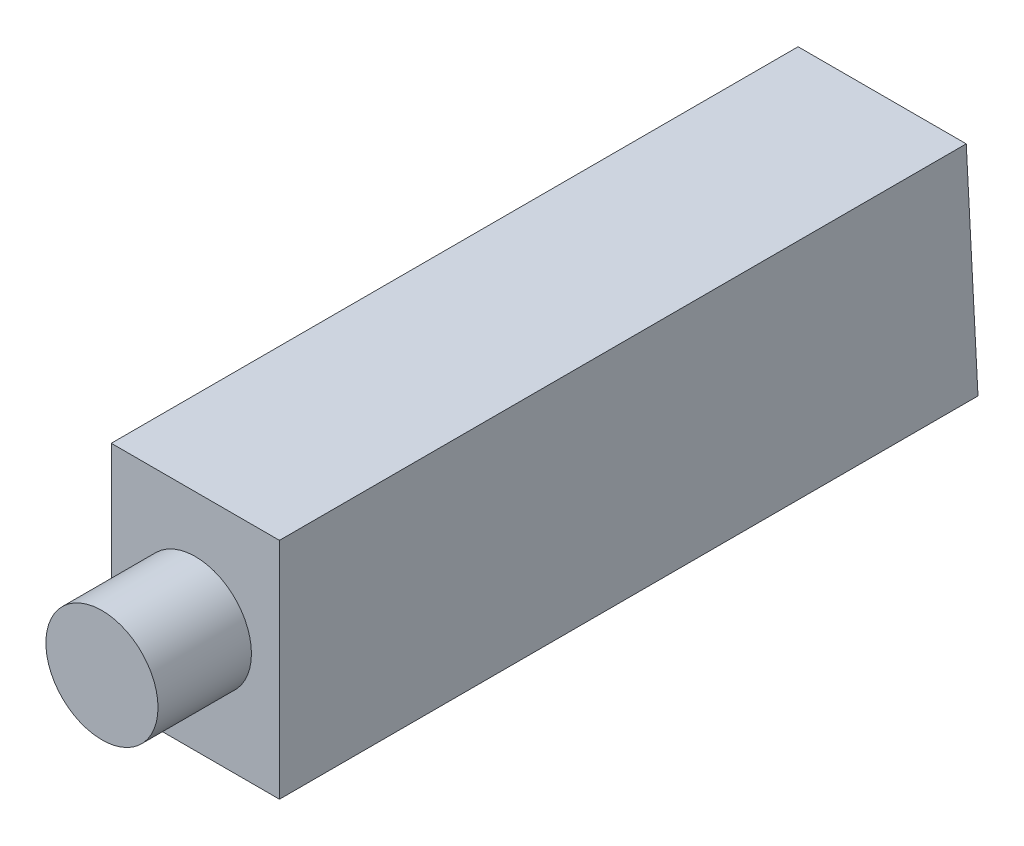
ISO-10303-21;
HEADER;
FILE_DESCRIPTION(('STEP AP214'),'2;1');
FILE_NAME('part.step','',(''),(''),'','','');
FILE_SCHEMA(('AUTOMOTIVE_DESIGN { 1 0 10303 214 1 1 1 1 }'));
ENDSEC;
DATA;
#1=APPLICATION_CONTEXT('core data for automotive mechanical design processes');
#2=APPLICATION_PROTOCOL_DEFINITION('international standard','automotive_design',2000,#1);
#3=PRODUCT_CONTEXT('',#1,'mechanical');
#4=PRODUCT('Part','Part','',(#3));
#5=PRODUCT_RELATED_PRODUCT_CATEGORY('part','',(#4));
#6=PRODUCT_DEFINITION_FORMATION('','',#4);
#7=PRODUCT_DEFINITION_CONTEXT('part definition',#1,'design');
#8=PRODUCT_DEFINITION('design','',#6,#7);
#9=PRODUCT_DEFINITION_SHAPE('','',#8);
#10=(LENGTH_UNIT() NAMED_UNIT(*) SI_UNIT(.MILLI.,.METRE.));
#11=(NAMED_UNIT(*) PLANE_ANGLE_UNIT() SI_UNIT($,.RADIAN.));
#12=(NAMED_UNIT(*) SI_UNIT($,.STERADIAN.) SOLID_ANGLE_UNIT());
#13=UNCERTAINTY_MEASURE_WITH_UNIT(LENGTH_MEASURE(1.E-05),#10,'distance_accuracy_value','');
#14=(GEOMETRIC_REPRESENTATION_CONTEXT(3) GLOBAL_UNCERTAINTY_ASSIGNED_CONTEXT((#13)) GLOBAL_UNIT_ASSIGNED_CONTEXT((#10,
#11,#12)) REPRESENTATION_CONTEXT('',''));
#15=CARTESIAN_POINT('',(0.,0.,0.));
#16=DIRECTION('',(0.,0.,1.));
#17=DIRECTION('',(1.,0.,0.));
#18=AXIS2_PLACEMENT_3D('',#15,#16,#17);
#19=CARTESIAN_POINT('',(77.,-28.,0.));
#20=DIRECTION('',(0.,1.,0.));
#21=DIRECTION('',(0.,0.,1.));
#22=AXIS2_PLACEMENT_3D('',#19,#20,#21);
#23=PLANE('',#22);
#24=DIRECTION('',(-1.,0.,0.));
#25=VECTOR('',#24,1.);
#26=CARTESIAN_POINT('',(78.,-28.,-55.0000000000002));
#27=LINE('',#26,#25);
#28=CARTESIAN_POINT('',(77.,-28.,-55.0000000000002));
#29=VERTEX_POINT('',#28);
#30=CARTESIAN_POINT('',(68.,-28.,-55.0000000000002));
#31=VERTEX_POINT('',#30);
#32=EDGE_CURVE('E77',#29,#31,#27,.T.);
#33=ORIENTED_EDGE('',*,*,#32,.F.);
#34=DIRECTION('',(0.,0.,-1.));
#35=VECTOR('',#34,1.);
#36=CARTESIAN_POINT('',(77.,-28.,0.));
#37=LINE('',#36,#35);
#38=CARTESIAN_POINT('',(77.,-28.,-91.7564635276594));
#39=VERTEX_POINT('',#38);
#40=EDGE_CURVE('E60',#29,#39,#37,.T.);
#41=ORIENTED_EDGE('',*,*,#40,.T.);
#42=DIRECTION('',(-1.,0.,0.));
#43=VECTOR('',#42,1.);
#44=CARTESIAN_POINT('',(77.,-28.,-91.7564635276594));
#45=LINE('',#44,#43);
#46=CARTESIAN_POINT('',(68.,-28.,-91.7564635276594));
#47=VERTEX_POINT('',#46);
#48=EDGE_CURVE('E92',#39,#47,#45,.T.);
#49=ORIENTED_EDGE('',*,*,#48,.T.);
#50=DIRECTION('',(0.,0.,-1.));
#51=VECTOR('',#50,1.);
#52=CARTESIAN_POINT('',(68.,-28.,0.));
#53=LINE('',#52,#51);
#54=EDGE_CURVE('E87',#31,#47,#53,.T.);
#55=ORIENTED_EDGE('',*,*,#54,.F.);
#56=EDGE_LOOP('',(#33,#41,#49,#55));
#57=FACE_BOUND('',#56,.T.);
#58=ADVANCED_FACE('F37',(#57),#23,.T.);
#59=CARTESIAN_POINT('',(68.,-28.,0.));
#60=DIRECTION('',(-1.,0.,0.));
#61=DIRECTION('',(0.,0.,1.));
#62=AXIS2_PLACEMENT_3D('',#59,#60,#61);
#63=PLANE('',#62);
#64=DIRECTION('',(0.,-1.,0.));
#65=VECTOR('',#64,1.);
#66=CARTESIAN_POINT('',(68.,-1.9081958235745E-13,-55.0000000000003));
#67=LINE('',#66,#65);
#68=CARTESIAN_POINT('',(68.,-40.,-55.0000000000002));
#69=VERTEX_POINT('',#68);
#70=EDGE_CURVE('E80',#31,#69,#67,.T.);
#71=ORIENTED_EDGE('',*,*,#70,.F.);
#72=ORIENTED_EDGE('',*,*,#54,.T.);
#73=DIRECTION('',(0.,0.998629534754574,0.0523359562429409));
#74=VECTOR('',#73,1.);
#75=CARTESIAN_POINT('',(68.,-40.,-92.3853568790559));
#76=LINE('',#75,#74);
#77=CARTESIAN_POINT('',(68.,-40.,-92.3853568790559));
#78=VERTEX_POINT('',#77);
#79=EDGE_CURVE('E106',#78,#47,#76,.T.);
#80=ORIENTED_EDGE('',*,*,#79,.F.);
#81=DIRECTION('',(0.,0.,-1.));
#82=VECTOR('',#81,1.);
#83=CARTESIAN_POINT('',(68.,-40.,0.));
#84=LINE('',#83,#82);
#85=EDGE_CURVE('E89',#69,#78,#84,.T.);
#86=ORIENTED_EDGE('',*,*,#85,.F.);
#87=EDGE_LOOP('',(#71,#72,#80,#86));
#88=FACE_BOUND('',#87,.T.);
#89=ADVANCED_FACE('F85',(#88),#63,.T.);
#90=CARTESIAN_POINT('',(77.,-40.,0.));
#91=DIRECTION('',(0.,-1.,0.));
#92=DIRECTION('',(1.,0.,0.));
#93=AXIS2_PLACEMENT_3D('',#90,#91,#92);
#94=PLANE('',#93);
#95=DIRECTION('',(-1.,0.,0.));
#96=VECTOR('',#95,1.);
#97=CARTESIAN_POINT('',(78.,-40.,-55.0000000000002));
#98=LINE('',#97,#96);
#99=CARTESIAN_POINT('',(77.,-40.,-55.0000000000002));
#100=VERTEX_POINT('',#99);
#101=EDGE_CURVE('E52',#100,#69,#98,.T.);
#102=ORIENTED_EDGE('',*,*,#101,.T.);
#103=ORIENTED_EDGE('',*,*,#85,.T.);
#104=DIRECTION('',(-1.,0.,0.));
#105=VECTOR('',#104,1.);
#106=CARTESIAN_POINT('',(77.,-40.,-92.3853568790559));
#107=LINE('',#106,#105);
#108=CARTESIAN_POINT('',(77.,-40.,-92.3853568790559));
#109=VERTEX_POINT('',#108);
#110=EDGE_CURVE('E99',#109,#78,#107,.T.);
#111=ORIENTED_EDGE('',*,*,#110,.F.);
#112=DIRECTION('',(0.,0.,-1.));
#113=VECTOR('',#112,1.);
#114=CARTESIAN_POINT('',(77.,-40.,0.));
#115=LINE('',#114,#113);
#116=EDGE_CURVE('E94',#100,#109,#115,.T.);
#117=ORIENTED_EDGE('',*,*,#116,.F.);
#118=EDGE_LOOP('',(#102,#103,#111,#117));
#119=FACE_BOUND('',#118,.T.);
#120=ADVANCED_FACE('F134',(#119),#94,.T.);
#121=CARTESIAN_POINT('',(77.,-40.,0.));
#122=DIRECTION('',(1.,0.,0.));
#123=DIRECTION('',(0.,0.,-1.));
#124=AXIS2_PLACEMENT_3D('',#121,#122,#123);
#125=PLANE('',#124);
#126=DIRECTION('',(0.,1.,0.));
#127=VECTOR('',#126,1.);
#128=CARTESIAN_POINT('',(77.,-40.0000000000002,-55.0000000000002));
#129=LINE('',#128,#127);
#130=EDGE_CURVE('E40',#100,#29,#129,.T.);
#131=ORIENTED_EDGE('',*,*,#130,.F.);
#132=ORIENTED_EDGE('',*,*,#116,.T.);
#133=DIRECTION('',(0.,0.998629534754574,0.0523359562429409));
#134=VECTOR('',#133,1.);
#135=CARTESIAN_POINT('',(77.,-40.,-92.3853568790559));
#136=LINE('',#135,#134);
#137=EDGE_CURVE('E104',#109,#39,#136,.T.);
#138=ORIENTED_EDGE('',*,*,#137,.T.);
#139=ORIENTED_EDGE('',*,*,#40,.F.);
#140=EDGE_LOOP('',(#131,#132,#138,#139));
#141=FACE_BOUND('',#140,.T.);
#142=ADVANCED_FACE('F128',(#141),#125,.T.);
#143=CARTESIAN_POINT('',(77.,-40.,-92.3853568790559));
#144=DIRECTION('',(0.,-0.0523359562429409,0.998629534754574));
#145=DIRECTION('',(0.,-0.998629534754574,-0.0523359562429409));
#146=AXIS2_PLACEMENT_3D('',#143,#144,#145);
#147=PLANE('',#146);
#148=ORIENTED_EDGE('',*,*,#79,.T.);
#149=ORIENTED_EDGE('',*,*,#48,.F.);
#150=ORIENTED_EDGE('',*,*,#137,.F.);
#151=ORIENTED_EDGE('',*,*,#110,.T.);
#152=EDGE_LOOP('',(#148,#149,#150,#151));
#153=FACE_BOUND('',#152,.T.);
#154=ADVANCED_FACE('F123',(#153),#147,.F.);
#155=CARTESIAN_POINT('',(78.,-1.9081958235745E-13,-55.0000000000003));
#156=DIRECTION('',(0.,0.,-1.));
#157=DIRECTION('',(0.,1.,0.));
#158=AXIS2_PLACEMENT_3D('',#155,#156,#157);
#159=PLANE('',#158);
#160=CARTESIAN_POINT('',(72.5,-34.,-55.0000000000003));
#161=DIRECTION('',(0.,0.,1.));
#162=DIRECTION('',(1.,0.,0.));
#163=AXIS2_PLACEMENT_3D('',#160,#161,#162);
#164=CIRCLE('',#163,3.00000000000001);
#165=CARTESIAN_POINT('',(75.5,-34.,-55.0000000000003));
#166=VERTEX_POINT('',#165);
#167=EDGE_CURVE('E11',#166,#166,#164,.T.);
#168=ORIENTED_EDGE('',*,*,#167,.F.);
#169=EDGE_LOOP('',(#168));
#170=FACE_BOUND('',#169,.T.);
#171=ORIENTED_EDGE('',*,*,#130,.T.);
#172=ORIENTED_EDGE('',*,*,#32,.T.);
#173=ORIENTED_EDGE('',*,*,#70,.T.);
#174=ORIENTED_EDGE('',*,*,#101,.F.);
#175=EDGE_LOOP('',(#171,#172,#173,#174));
#176=FACE_BOUND('',#175,.T.);
#177=ADVANCED_FACE('F79',(#170,#176),#159,.F.);
#178=CARTESIAN_POINT('',(72.5,-34.,-50.0000000000003));
#179=DIRECTION('',(0.,0.,-1.));
#180=DIRECTION('',(-1.,0.,0.));
#181=AXIS2_PLACEMENT_3D('',#178,#179,#180);
#182=CYLINDRICAL_SURFACE('',#181,3.00000000000001);
#183=CARTESIAN_POINT('',(72.5,-34.,-50.0000000000003));
#184=DIRECTION('',(0.,0.,1.));
#185=DIRECTION('',(1.,0.,0.));
#186=AXIS2_PLACEMENT_3D('',#183,#184,#185);
#187=CIRCLE('',#186,3.00000000000001);
#188=CARTESIAN_POINT('',(75.5,-34.,-50.0000000000003));
#189=VERTEX_POINT('',#188);
#190=EDGE_CURVE('E90',#189,#189,#187,.T.);
#191=ORIENTED_EDGE('',*,*,#190,.F.);
#192=EDGE_LOOP('',(#191));
#193=FACE_BOUND('',#192,.T.);
#194=ORIENTED_EDGE('',*,*,#167,.T.);
#195=EDGE_LOOP('',(#194));
#196=FACE_BOUND('',#195,.T.);
#197=ADVANCED_FACE('F116',(#193,#196),#182,.T.);
#198=CARTESIAN_POINT('',(72.5,-34.,-50.0000000000003));
#199=DIRECTION('',(0.,0.,1.));
#200=DIRECTION('',(1.,0.,0.));
#201=AXIS2_PLACEMENT_3D('',#198,#199,#200);
#202=PLANE('',#201);
#203=ORIENTED_EDGE('',*,*,#190,.T.);
#204=EDGE_LOOP('',(#203));
#205=FACE_BOUND('',#204,.T.);
#206=ADVANCED_FACE('F114',(#205),#202,.T.);
#207=CLOSED_SHELL('',(#58,#89,#120,#142,#154,#177,#197,#206));
#208=MANIFOLD_SOLID_BREP('B2',#207);
#209=ADVANCED_BREP_SHAPE_REPRESENTATION('',(#18,#208),#14);
#210=SHAPE_DEFINITION_REPRESENTATION(#9,#209);
ENDSEC;
END-ISO-10303-21;
